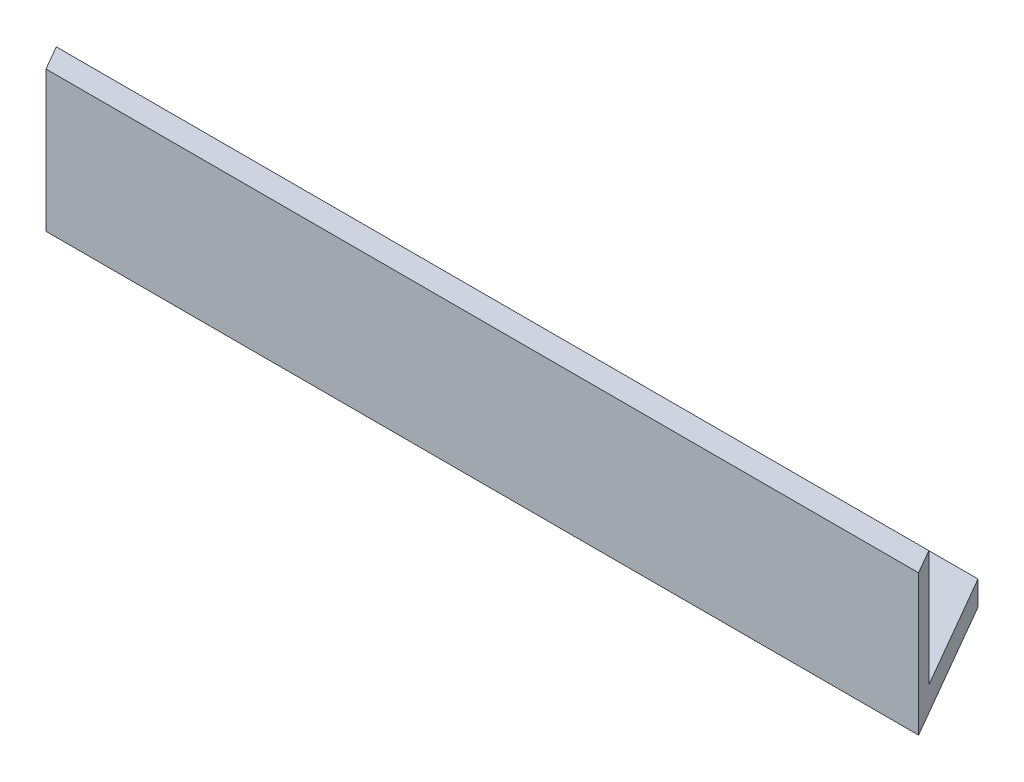
ISO-10303-21;
HEADER;
FILE_DESCRIPTION(('STEP AP214'),'2;1');
FILE_NAME('part.step','',(''),(''),'','','');
FILE_SCHEMA(('AUTOMOTIVE_DESIGN { 1 0 10303 214 1 1 1 1 }'));
ENDSEC;
DATA;
#1=APPLICATION_CONTEXT('core data for automotive mechanical design processes');
#2=APPLICATION_PROTOCOL_DEFINITION('international standard','automotive_design',2000,#1);
#3=PRODUCT_CONTEXT('',#1,'mechanical');
#4=PRODUCT('Part','Part','',(#3));
#5=PRODUCT_RELATED_PRODUCT_CATEGORY('part','',(#4));
#6=PRODUCT_DEFINITION_FORMATION('','',#4);
#7=PRODUCT_DEFINITION_CONTEXT('part definition',#1,'design');
#8=PRODUCT_DEFINITION('design','',#6,#7);
#9=PRODUCT_DEFINITION_SHAPE('','',#8);
#10=(LENGTH_UNIT() NAMED_UNIT(*) SI_UNIT(.MILLI.,.METRE.));
#11=(NAMED_UNIT(*) PLANE_ANGLE_UNIT() SI_UNIT($,.RADIAN.));
#12=(NAMED_UNIT(*) SI_UNIT($,.STERADIAN.) SOLID_ANGLE_UNIT());
#13=UNCERTAINTY_MEASURE_WITH_UNIT(LENGTH_MEASURE(1.E-05),#10,'distance_accuracy_value','');
#14=(GEOMETRIC_REPRESENTATION_CONTEXT(3) GLOBAL_UNCERTAINTY_ASSIGNED_CONTEXT((#13)) GLOBAL_UNIT_ASSIGNED_CONTEXT((#10,
#11,#12)) REPRESENTATION_CONTEXT('',''));
#15=CARTESIAN_POINT('',(0.,0.,0.));
#16=DIRECTION('',(0.,0.,1.));
#17=DIRECTION('',(1.,0.,0.));
#18=AXIS2_PLACEMENT_3D('',#15,#16,#17);
#19=CARTESIAN_POINT('',(240.,20.,0.));
#20=DIRECTION('',(0.,0.,-1.));
#21=DIRECTION('',(0.,1.,0.));
#22=AXIS2_PLACEMENT_3D('',#19,#20,#21);
#23=PLANE('',#22);
#24=DIRECTION('',(-1.,0.,0.));
#25=VECTOR('',#24,1.);
#26=CARTESIAN_POINT('',(240.,20.,0.));
#27=LINE('',#26,#25);
#28=CARTESIAN_POINT('',(135.677313259562,20.,0.));
#29=VERTEX_POINT('',#28);
#30=CARTESIAN_POINT('',(11.5470053837926,20.,0.));
#31=VERTEX_POINT('',#30);
#32=EDGE_CURVE('E103',#29,#31,#27,.T.);
#33=ORIENTED_EDGE('',*,*,#32,.T.);
#34=DIRECTION('',(0.,-1.,0.));
#35=VECTOR('',#34,1.);
#36=CARTESIAN_POINT('',(11.5470053837926,20.,0.));
#37=LINE('',#36,#35);
#38=CARTESIAN_POINT('',(11.5470053837926,0.,0.));
#39=VERTEX_POINT('',#38);
#40=EDGE_CURVE('E87',#31,#39,#37,.T.);
#41=ORIENTED_EDGE('',*,*,#40,.T.);
#42=DIRECTION('',(-1.,0.,0.));
#43=VECTOR('',#42,1.);
#44=CARTESIAN_POINT('',(240.,0.,0.));
#45=LINE('',#44,#43);
#46=CARTESIAN_POINT('',(135.677313259562,0.,0.));
#47=VERTEX_POINT('',#46);
#48=EDGE_CURVE('E11',#47,#39,#45,.T.);
#49=ORIENTED_EDGE('',*,*,#48,.F.);
#50=DIRECTION('',(0.,-1.,0.));
#51=VECTOR('',#50,1.);
#52=CARTESIAN_POINT('',(135.677313259562,20.,0.));
#53=LINE('',#52,#51);
#54=EDGE_CURVE('E108',#29,#47,#53,.T.);
#55=ORIENTED_EDGE('',*,*,#54,.F.);
#56=EDGE_LOOP('',(#33,#41,#49,#55));
#57=FACE_BOUND('',#56,.T.);
#58=ADVANCED_FACE('F37',(#57),#23,.F.);
#59=CARTESIAN_POINT('',(240.,0.,0.));
#60=DIRECTION('',(0.,1.,0.));
#61=DIRECTION('',(0.,0.,1.));
#62=AXIS2_PLACEMENT_3D('',#59,#60,#61);
#63=PLANE('',#62);
#64=ORIENTED_EDGE('',*,*,#48,.T.);
#65=DIRECTION('',(0.500000000000001,0.,0.866025403784438));
#66=VECTOR('',#65,1.);
#67=CARTESIAN_POINT('',(0.,0.,-20.));
#68=LINE('',#67,#66);
#69=CARTESIAN_POINT('',(0.,0.,-20.));
#70=VERTEX_POINT('',#69);
#71=EDGE_CURVE('E93',#70,#39,#68,.T.);
#72=ORIENTED_EDGE('',*,*,#71,.F.);
#73=DIRECTION('',(-1.,0.,0.));
#74=VECTOR('',#73,1.);
#75=CARTESIAN_POINT('',(240.,0.,-20.));
#76=LINE('',#75,#74);
#77=CARTESIAN_POINT('',(124.13030787577,0.,-20.));
#78=VERTEX_POINT('',#77);
#79=EDGE_CURVE('E44',#78,#70,#76,.T.);
#80=ORIENTED_EDGE('',*,*,#79,.F.);
#81=DIRECTION('',(-0.500000000000002,0.,-0.866025403784438));
#82=VECTOR('',#81,1.);
#83=CARTESIAN_POINT('',(135.677313259562,0.,0.));
#84=LINE('',#83,#82);
#85=EDGE_CURVE('E131',#47,#78,#84,.T.);
#86=ORIENTED_EDGE('',*,*,#85,.F.);
#87=EDGE_LOOP('',(#64,#72,#80,#86));
#88=FACE_BOUND('',#87,.T.);
#89=ADVANCED_FACE('F130',(#88),#63,.F.);
#90=CARTESIAN_POINT('',(240.,0.,-20.));
#91=DIRECTION('',(0.,0.,1.));
#92=DIRECTION('',(1.,0.,0.));
#93=AXIS2_PLACEMENT_3D('',#90,#91,#92);
#94=PLANE('',#93);
#95=DIRECTION('',(-1.,0.,0.));
#96=VECTOR('',#95,1.);
#97=CARTESIAN_POINT('',(240.,3.46117846701572,-20.));
#98=LINE('',#97,#96);
#99=CARTESIAN_POINT('',(124.13030787577,3.46117846701572,-20.));
#100=VERTEX_POINT('',#99);
#101=CARTESIAN_POINT('',(0.,3.46117846701572,-20.));
#102=VERTEX_POINT('',#101);
#103=EDGE_CURVE('E120',#100,#102,#98,.T.);
#104=ORIENTED_EDGE('',*,*,#103,.F.);
#105=DIRECTION('',(0.,-1.,0.));
#106=VECTOR('',#105,1.);
#107=CARTESIAN_POINT('',(124.13030787577,20.,-20.));
#108=LINE('',#107,#106);
#109=EDGE_CURVE('E127',#100,#78,#108,.T.);
#110=ORIENTED_EDGE('',*,*,#109,.T.);
#111=ORIENTED_EDGE('',*,*,#79,.T.);
#112=DIRECTION('',(0.,1.,0.));
#113=VECTOR('',#112,1.);
#114=CARTESIAN_POINT('',(0.,0.,-20.));
#115=LINE('',#114,#113);
#116=EDGE_CURVE('E109',#70,#102,#115,.T.);
#117=ORIENTED_EDGE('',*,*,#116,.T.);
#118=EDGE_LOOP('',(#104,#110,#111,#117));
#119=FACE_BOUND('',#118,.T.);
#120=ADVANCED_FACE('F126',(#119),#94,.F.);
#121=CARTESIAN_POINT('',(240.,3.46117846701572,-20.));
#122=DIRECTION('',(0.,-1.,0.));
#123=DIRECTION('',(0.,0.,-1.));
#124=AXIS2_PLACEMENT_3D('',#121,#122,#123);
#125=PLANE('',#124);
#126=ORIENTED_EDGE('',*,*,#103,.T.);
#127=DIRECTION('',(0.500000000000001,0.,0.866025403784438));
#128=VECTOR('',#127,1.);
#129=CARTESIAN_POINT('',(60.0000000000003,3.46117846701571,83.9230484541328));
#130=LINE('',#129,#128);
#131=CARTESIAN_POINT('',(9.54869306414768,3.46117846701572,-3.46117846701572));
#132=VERTEX_POINT('',#131);
#133=EDGE_CURVE('E59',#102,#132,#130,.T.);
#134=ORIENTED_EDGE('',*,*,#133,.T.);
#135=DIRECTION('',(-1.,0.,0.));
#136=VECTOR('',#135,1.);
#137=CARTESIAN_POINT('',(240.,3.46117846701572,-3.46117846701572));
#138=LINE('',#137,#136);
#139=CARTESIAN_POINT('',(133.679000939917,3.46117846701572,-3.46117846701572));
#140=VERTEX_POINT('',#139);
#141=EDGE_CURVE('E111',#140,#132,#138,.T.);
#142=ORIENTED_EDGE('',*,*,#141,.F.);
#143=DIRECTION('',(-0.500000000000002,0.,-0.866025403784438));
#144=VECTOR('',#143,1.);
#145=CARTESIAN_POINT('',(153.097730906827,3.46117846701571,30.1730484541327));
#146=LINE('',#145,#144);
#147=EDGE_CURVE('E114',#140,#100,#146,.T.);
#148=ORIENTED_EDGE('',*,*,#147,.T.);
#149=EDGE_LOOP('',(#126,#134,#142,#148));
#150=FACE_BOUND('',#149,.T.);
#151=ADVANCED_FACE('F144',(#150),#125,.F.);
#152=CARTESIAN_POINT('',(240.,3.46117846701572,-3.46117846701572));
#153=DIRECTION('',(0.,0.,1.));
#154=DIRECTION('',(1.,0.,0.));
#155=AXIS2_PLACEMENT_3D('',#152,#153,#154);
#156=PLANE('',#155);
#157=ORIENTED_EDGE('',*,*,#141,.T.);
#158=DIRECTION('',(0.,1.,0.));
#159=VECTOR('',#158,1.);
#160=CARTESIAN_POINT('',(9.54869306414768,3.46117846701572,-3.46117846701572));
#161=LINE('',#160,#159);
#162=CARTESIAN_POINT('',(9.54869306414769,20.,-3.46117846701571));
#163=VERTEX_POINT('',#162);
#164=EDGE_CURVE('E97',#132,#163,#161,.T.);
#165=ORIENTED_EDGE('',*,*,#164,.T.);
#166=DIRECTION('',(-1.,0.,0.));
#167=VECTOR('',#166,1.);
#168=CARTESIAN_POINT('',(240.,20.,-3.46117846701572));
#169=LINE('',#168,#167);
#170=CARTESIAN_POINT('',(133.679000939917,20.,-3.46117846701572));
#171=VERTEX_POINT('',#170);
#172=EDGE_CURVE('E105',#171,#163,#169,.T.);
#173=ORIENTED_EDGE('',*,*,#172,.F.);
#174=DIRECTION('',(0.,-1.,0.));
#175=VECTOR('',#174,1.);
#176=CARTESIAN_POINT('',(133.679000939917,3.46117846701572,-3.46117846701572));
#177=LINE('',#176,#175);
#178=EDGE_CURVE('E51',#171,#140,#177,.T.);
#179=ORIENTED_EDGE('',*,*,#178,.T.);
#180=EDGE_LOOP('',(#157,#165,#173,#179));
#181=FACE_BOUND('',#180,.T.);
#182=ADVANCED_FACE('F147',(#181),#156,.F.);
#183=CARTESIAN_POINT('',(240.,20.,-3.46117846701572));
#184=DIRECTION('',(0.,-1.,0.));
#185=DIRECTION('',(0.,0.,-1.));
#186=AXIS2_PLACEMENT_3D('',#183,#184,#185);
#187=PLANE('',#186);
#188=ORIENTED_EDGE('',*,*,#172,.T.);
#189=DIRECTION('',(0.500000000000001,0.,0.866025403784438));
#190=VECTOR('',#189,1.);
#191=CARTESIAN_POINT('',(0.,20.,-20.));
#192=LINE('',#191,#190);
#193=EDGE_CURVE('E90',#163,#31,#192,.T.);
#194=ORIENTED_EDGE('',*,*,#193,.T.);
#195=ORIENTED_EDGE('',*,*,#32,.F.);
#196=DIRECTION('',(-0.500000000000002,0.,-0.866025403784438));
#197=VECTOR('',#196,1.);
#198=CARTESIAN_POINT('',(135.677313259562,20.,0.));
#199=LINE('',#198,#197);
#200=EDGE_CURVE('E133',#29,#171,#199,.T.);
#201=ORIENTED_EDGE('',*,*,#200,.T.);
#202=EDGE_LOOP('',(#188,#194,#195,#201));
#203=FACE_BOUND('',#202,.T.);
#204=ADVANCED_FACE('F102',(#203),#187,.F.);
#205=CARTESIAN_POINT('',(0.,20.,-20.));
#206=DIRECTION('',(0.866025403784438,0.,-0.500000000000001));
#207=DIRECTION('',(-0.500000000000001,0.,-0.866025403784438));
#208=AXIS2_PLACEMENT_3D('',#205,#206,#207);
#209=PLANE('',#208);
#210=ORIENTED_EDGE('',*,*,#116,.F.);
#211=ORIENTED_EDGE('',*,*,#71,.T.);
#212=ORIENTED_EDGE('',*,*,#40,.F.);
#213=ORIENTED_EDGE('',*,*,#193,.F.);
#214=ORIENTED_EDGE('',*,*,#164,.F.);
#215=ORIENTED_EDGE('',*,*,#133,.F.);
#216=EDGE_LOOP('',(#210,#211,#212,#213,#214,#215));
#217=FACE_BOUND('',#216,.T.);
#218=ADVANCED_FACE('F89',(#217),#209,.F.);
#219=CARTESIAN_POINT('',(135.677313259562,20.,0.));
#220=DIRECTION('',(-0.866025403784438,0.,0.500000000000002));
#221=DIRECTION('',(0.500000000000002,0.,0.866025403784438));
#222=AXIS2_PLACEMENT_3D('',#219,#220,#221);
#223=PLANE('',#222);
#224=ORIENTED_EDGE('',*,*,#178,.F.);
#225=ORIENTED_EDGE('',*,*,#200,.F.);
#226=ORIENTED_EDGE('',*,*,#54,.T.);
#227=ORIENTED_EDGE('',*,*,#85,.T.);
#228=ORIENTED_EDGE('',*,*,#109,.F.);
#229=ORIENTED_EDGE('',*,*,#147,.F.);
#230=EDGE_LOOP('',(#224,#225,#226,#227,#228,#229));
#231=FACE_BOUND('',#230,.T.);
#232=ADVANCED_FACE('F145',(#231),#223,.F.);
#233=CLOSED_SHELL('',(#58,#89,#120,#151,#182,#204,#218,#232));
#234=MANIFOLD_SOLID_BREP('B2',#233);
#235=ADVANCED_BREP_SHAPE_REPRESENTATION('',(#18,#234),#14);
#236=SHAPE_DEFINITION_REPRESENTATION(#9,#235);
ENDSEC;
END-ISO-10303-21;
